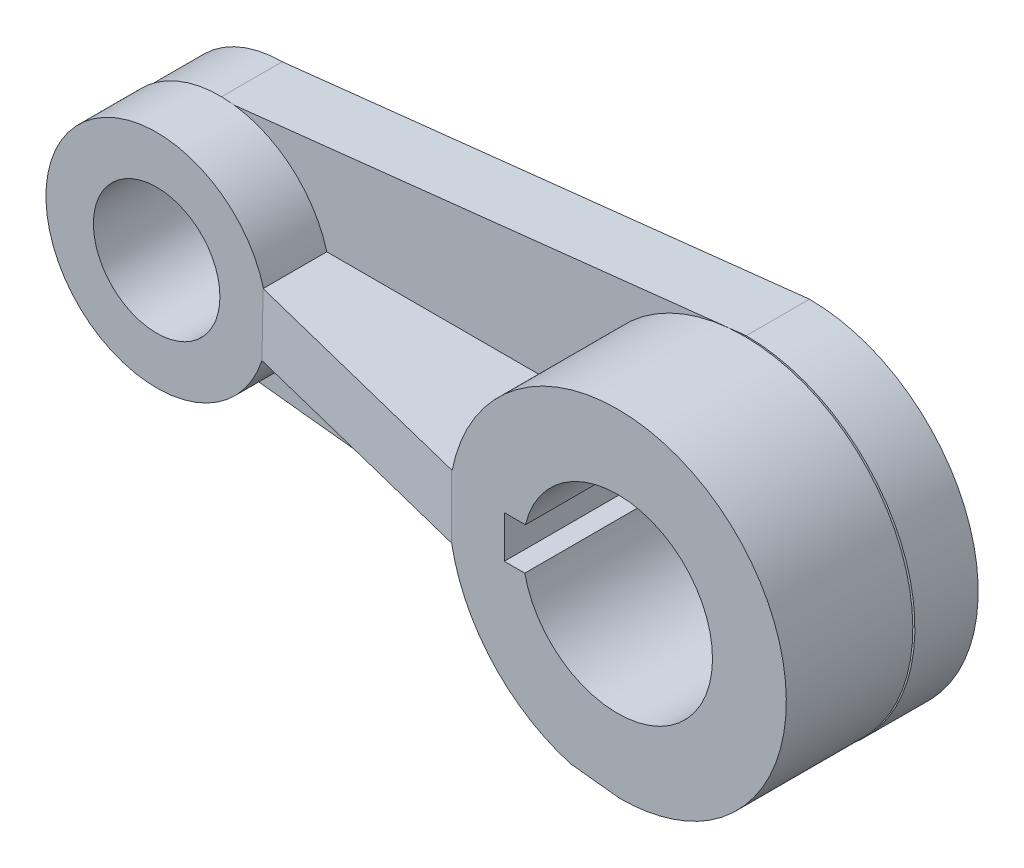
ISO-10303-21;
HEADER;
FILE_DESCRIPTION(('STEP AP214'),'2;1');
FILE_NAME('part.step','',(''),(''),'','','');
FILE_SCHEMA(('AUTOMOTIVE_DESIGN { 1 0 10303 214 1 1 1 1 }'));
ENDSEC;
DATA;
#1=APPLICATION_CONTEXT('core data for automotive mechanical design processes');
#2=APPLICATION_PROTOCOL_DEFINITION('international standard','automotive_design',2000,#1);
#3=PRODUCT_CONTEXT('',#1,'mechanical');
#4=PRODUCT('Part','Part','',(#3));
#5=PRODUCT_RELATED_PRODUCT_CATEGORY('part','',(#4));
#6=PRODUCT_DEFINITION_FORMATION('','',#4);
#7=PRODUCT_DEFINITION_CONTEXT('part definition',#1,'design');
#8=PRODUCT_DEFINITION('design','',#6,#7);
#9=PRODUCT_DEFINITION_SHAPE('','',#8);
#10=(LENGTH_UNIT() NAMED_UNIT(*) SI_UNIT(.MILLI.,.METRE.));
#11=(NAMED_UNIT(*) PLANE_ANGLE_UNIT() SI_UNIT($,.RADIAN.));
#12=(NAMED_UNIT(*) SI_UNIT($,.STERADIAN.) SOLID_ANGLE_UNIT());
#13=UNCERTAINTY_MEASURE_WITH_UNIT(LENGTH_MEASURE(1.E-05),#10,'distance_accuracy_value','');
#14=(GEOMETRIC_REPRESENTATION_CONTEXT(3) GLOBAL_UNCERTAINTY_ASSIGNED_CONTEXT((#13)) GLOBAL_UNIT_ASSIGNED_CONTEXT((#10,
#11,#12)) REPRESENTATION_CONTEXT('',''));
#15=CARTESIAN_POINT('',(0.,0.,0.));
#16=DIRECTION('',(0.,0.,1.));
#17=DIRECTION('',(1.,0.,0.));
#18=AXIS2_PLACEMENT_3D('',#15,#16,#17);
#19=CARTESIAN_POINT('',(0.,0.,0.));
#20=DIRECTION('',(0.,0.,1.));
#21=DIRECTION('',(1.,0.,0.));
#22=AXIS2_PLACEMENT_3D('',#19,#20,#21);
#23=PLANE('',#22);
#24=CARTESIAN_POINT('',(52.5139969891404,-0.249200158089699,0.));
#25=DIRECTION('',(0.,0.,1.));
#26=DIRECTION('',(1.,0.,0.));
#27=AXIS2_PLACEMENT_3D('',#24,#25,#26);
#28=CIRCLE('',#27,32.);
#29=CARTESIAN_POINT('',(21.0349833264114,-6.,0.));
#30=VERTEX_POINT('',#29);
#31=CARTESIAN_POINT('',(43.5657181596066,-30.9726164067577,0.));
#32=VERTEX_POINT('',#31);
#33=EDGE_CURVE('E192',#30,#32,#28,.T.);
#34=ORIENTED_EDGE('',*,*,#33,.F.);
#35=DIRECTION('',(1.,0.,0.));
#36=VECTOR('',#35,1.);
#37=CARTESIAN_POINT('',(-26.9476199003052,-6.,0.));
#38=LINE('',#37,#36);
#39=CARTESIAN_POINT('',(-26.9476199003052,-6.,0.));
#40=VERTEX_POINT('',#39);
#41=EDGE_CURVE('E172',#40,#30,#38,.T.);
#42=ORIENTED_EDGE('',*,*,#41,.F.);
#43=CARTESIAN_POINT('',(-46.916866088649,0.498400316179391,0.));
#44=DIRECTION('',(0.,0.,1.));
#45=DIRECTION('',(1.,0.,0.));
#46=AXIS2_PLACEMENT_3D('',#43,#44,#45);
#47=CIRCLE('',#46,21.);
#48=CARTESIAN_POINT('',(-66.7861244383313,7.2963832989162,0.));
#49=VERTEX_POINT('',#48);
#50=EDGE_CURVE('E204',#49,#40,#47,.T.);
#51=ORIENTED_EDGE('',*,*,#50,.F.);
#52=CARTESIAN_POINT('',(-47.0944309927361,0.,0.));
#53=DIRECTION('',(0.,0.,1.));
#54=DIRECTION('',(1.,0.,0.));
#55=AXIS2_PLACEMENT_3D('',#52,#53,#54);
#56=CIRCLE('',#55,21.);
#57=CARTESIAN_POINT('',(-47.0944309927361,-21.,0.));
#58=VERTEX_POINT('',#57);
#59=EDGE_CURVE('E226',#49,#58,#56,.T.);
#60=ORIENTED_EDGE('',*,*,#59,.T.);
#61=DIRECTION('',(0.994004355935433,-0.109340479152898,0.));
#62=VECTOR('',#61,1.);
#63=CARTESIAN_POINT('',(-2.84541311630482,-25.8673919664074,0.));
#64=LINE('',#63,#62);
#65=EDGE_CURVE('E200',#58,#32,#64,.T.);
#66=ORIENTED_EDGE('',*,*,#65,.T.);
#67=EDGE_LOOP('',(#34,#42,#51,#60,#66));
#68=FACE_BOUND('',#67,.T.);
#69=ADVANCED_FACE('F35',(#68),#23,.T.);
#70=CARTESIAN_POINT('',(-46.916866088649,0.498400316179391,12.));
#71=DIRECTION('',(0.,0.,-1.));
#72=DIRECTION('',(-1.,0.,0.));
#73=AXIS2_PLACEMENT_3D('',#70,#71,#72);
#74=CYLINDRICAL_SURFACE('',#73,21.);
#75=DIRECTION('',(0.,0.,-1.));
#76=VECTOR('',#75,1.);
#77=CARTESIAN_POINT('',(-26.6503320751827,6.,24.));
#78=LINE('',#77,#76);
#79=CARTESIAN_POINT('',(-26.6503320751827,6.,12.));
#80=VERTEX_POINT('',#79);
#81=CARTESIAN_POINT('',(-26.6503320751827,6.,0.));
#82=VERTEX_POINT('',#81);
#83=EDGE_CURVE('E250',#80,#82,#78,.T.);
#84=ORIENTED_EDGE('',*,*,#83,.T.);
#85=CARTESIAN_POINT('',(-44.1853647466023,21.3199972870747,0.));
#86=VERTEX_POINT('',#85);
#87=EDGE_CURVE('E203',#82,#86,#47,.T.);
#88=ORIENTED_EDGE('',*,*,#87,.T.);
#89=EDGE_CURVE('E197',#86,#49,#47,.T.);
#90=ORIENTED_EDGE('',*,*,#89,.T.);
#91=ORIENTED_EDGE('',*,*,#50,.T.);
#92=DIRECTION('',(0.,0.,-1.));
#93=VECTOR('',#92,1.);
#94=CARTESIAN_POINT('',(-26.9476199003052,-6.,24.));
#95=LINE('',#94,#93);
#96=CARTESIAN_POINT('',(-26.9476199003052,-6.,12.));
#97=VERTEX_POINT('',#96);
#98=EDGE_CURVE('E175',#97,#40,#95,.T.);
#99=ORIENTED_EDGE('',*,*,#98,.F.);
#100=CARTESIAN_POINT('',(-46.916866088649,0.498400316179391,12.));
#101=DIRECTION('',(0.,0.,1.));
#102=DIRECTION('',(1.,0.,0.));
#103=AXIS2_PLACEMENT_3D('',#100,#101,#102);
#104=CIRCLE('',#103,21.);
#105=EDGE_CURVE('E198',#80,#97,#104,.T.);
#106=ORIENTED_EDGE('',*,*,#105,.F.);
#107=EDGE_LOOP('',(#84,#88,#90,#91,#99,#106));
#108=FACE_BOUND('',#107,.T.);
#109=ADVANCED_FACE('F248',(#108),#74,.T.);
#110=CARTESIAN_POINT('',(-46.916866088649,0.498400316179391,12.));
#111=DIRECTION('',(0.,0.,1.));
#112=DIRECTION('',(1.,0.,0.));
#113=AXIS2_PLACEMENT_3D('',#110,#111,#112);
#114=PLANE('',#113);
#115=ORIENTED_EDGE('',*,*,#105,.T.);
#116=DIRECTION('',(0.0247663864034664,0.999693266009387,0.));
#117=VECTOR('',#116,1.);
#118=CARTESIAN_POINT('',(-26.798975987744,0.,12.));
#119=LINE('',#118,#117);
#120=EDGE_CURVE('E43',#97,#80,#119,.T.);
#121=ORIENTED_EDGE('',*,*,#120,.T.);
#122=EDGE_LOOP('',(#115,#121));
#123=FACE_BOUND('',#122,.T.);
#124=CARTESIAN_POINT('',(-46.916866088649,0.498400316179391,12.));
#125=DIRECTION('',(0.,0.,1.));
#126=DIRECTION('',(1.,0.,0.));
#127=AXIS2_PLACEMENT_3D('',#124,#125,#126);
#128=CIRCLE('',#127,12.);
#129=CARTESIAN_POINT('',(-34.916866088649,0.498400316179391,12.));
#130=VERTEX_POINT('',#129);
#131=EDGE_CURVE('E284',#130,#130,#128,.T.);
#132=ORIENTED_EDGE('',*,*,#131,.F.);
#133=EDGE_LOOP('',(#132));
#134=FACE_BOUND('',#133,.T.);
#135=ADVANCED_FACE('F242',(#123,#134),#114,.T.);
#136=CARTESIAN_POINT('',(52.5139969891404,-0.249200158089699,24.));
#137=DIRECTION('',(0.,0.,-1.));
#138=DIRECTION('',(-1.,0.,0.));
#139=AXIS2_PLACEMENT_3D('',#136,#137,#138);
#140=CYLINDRICAL_SURFACE('',#139,32.);
#141=CARTESIAN_POINT('',(52.5139969891404,-0.249200158089699,24.));
#142=DIRECTION('',(0.,0.,1.));
#143=DIRECTION('',(1.,0.,0.));
#144=AXIS2_PLACEMENT_3D('',#141,#142,#143);
#145=CIRCLE('',#144,32.);
#146=CARTESIAN_POINT('',(21.0349833264113,-6.,24.));
#147=VERTEX_POINT('',#146);
#148=CARTESIAN_POINT('',(43.5657181596066,-30.9726164067577,24.));
#149=VERTEX_POINT('',#148);
#150=EDGE_CURVE('E163',#147,#149,#145,.T.);
#151=ORIENTED_EDGE('',*,*,#150,.F.);
#152=DIRECTION('',(0.,0.,-1.));
#153=VECTOR('',#152,1.);
#154=CARTESIAN_POINT('',(21.0349833264114,-6.,24.));
#155=LINE('',#154,#153);
#156=EDGE_CURVE('E169',#147,#30,#155,.T.);
#157=ORIENTED_EDGE('',*,*,#156,.T.);
#158=ORIENTED_EDGE('',*,*,#33,.T.);
#159=DIRECTION('',(0.,0.,-1.));
#160=VECTOR('',#159,1.);
#161=CARTESIAN_POINT('',(43.5657181596066,-30.9726164067577,24.));
#162=LINE('',#161,#160);
#163=EDGE_CURVE('E180',#149,#32,#162,.T.);
#164=ORIENTED_EDGE('',*,*,#163,.F.);
#165=EDGE_LOOP('',(#151,#157,#158,#164));
#166=FACE_BOUND('',#165,.T.);
#167=ADVANCED_FACE('F178',(#166),#140,.T.);
#168=DIRECTION('',(1.,0.,0.));
#169=VECTOR('',#168,1.);
#170=CARTESIAN_POINT('',(-26.6503320751827,6.,0.));
#171=LINE('',#170,#169);
#172=CARTESIAN_POINT('',(21.1301237835571,6.,0.));
#173=VERTEX_POINT('',#172);
#174=EDGE_CURVE('E326',#82,#173,#171,.T.);
#175=ORIENTED_EDGE('',*,*,#174,.T.);
#176=CARTESIAN_POINT('',(69.8902284842106,-27.1204967220766,0.));
#177=VERTEX_POINT('',#176);
#178=EDGE_CURVE('E58',#177,#173,#28,.T.);
#179=ORIENTED_EDGE('',*,*,#178,.F.);
#180=CARTESIAN_POINT('',(52.9055690072639,0.,0.));
#181=DIRECTION('',(0.,0.,1.));
#182=DIRECTION('',(1.,0.,0.));
#183=AXIS2_PLACEMENT_3D('',#180,#181,#182);
#184=CIRCLE('',#183,32.);
#185=CARTESIAN_POINT('',(52.9055690072639,32.,0.));
#186=VERTEX_POINT('',#185);
#187=EDGE_CURVE('E220',#177,#186,#184,.T.);
#188=ORIENTED_EDGE('',*,*,#187,.T.);
#189=DIRECTION('',(0.994004355935433,0.109340479152898,0.));
#190=VECTOR('',#189,1.);
#191=CARTESIAN_POINT('',(-2.84541311630482,25.8673919664074,0.));
#192=LINE('',#191,#190);
#193=EDGE_CURVE('E222',#86,#186,#192,.T.);
#194=ORIENTED_EDGE('',*,*,#193,.F.);
#195=ORIENTED_EDGE('',*,*,#87,.F.);
#196=EDGE_LOOP('',(#175,#179,#188,#194,#195));
#197=FACE_BOUND('',#196,.T.);
#198=ADVANCED_FACE('F308',(#197),#23,.T.);
#199=CARTESIAN_POINT('',(-2.84541311630482,-25.8673919664074,-12.));
#200=DIRECTION('',(-0.109340479152898,-0.994004355935433,0.));
#201=DIRECTION('',(0.994004355935433,-0.109340479152898,0.));
#202=AXIS2_PLACEMENT_3D('',#199,#200,#201);
#203=PLANE('',#202);
#204=ORIENTED_EDGE('',*,*,#65,.F.);
#205=DIRECTION('',(0.,0.,1.));
#206=VECTOR('',#205,1.);
#207=CARTESIAN_POINT('',(-47.0944309927361,-21.,-12.));
#208=LINE('',#207,#206);
#209=CARTESIAN_POINT('',(-47.0944309927361,-21.,-12.));
#210=VERTEX_POINT('',#209);
#211=EDGE_CURVE('E229',#210,#58,#208,.T.);
#212=ORIENTED_EDGE('',*,*,#211,.F.);
#213=DIRECTION('',(0.994004355935433,-0.109340479152898,0.));
#214=VECTOR('',#213,1.);
#215=CARTESIAN_POINT('',(-2.84541311630482,-25.8673919664074,-12.));
#216=LINE('',#215,#214);
#217=CARTESIAN_POINT('',(52.9055690072639,-32.,-12.));
#218=VERTEX_POINT('',#217);
#219=EDGE_CURVE('E205',#210,#218,#216,.T.);
#220=ORIENTED_EDGE('',*,*,#219,.T.);
#221=DIRECTION('',(0.,0.,1.));
#222=VECTOR('',#221,1.);
#223=CARTESIAN_POINT('',(52.9055690072639,-32.,-12.));
#224=LINE('',#223,#222);
#225=CARTESIAN_POINT('',(52.9055690072639,-32.,24.));
#226=VERTEX_POINT('',#225);
#227=EDGE_CURVE('E217',#218,#226,#224,.T.);
#228=ORIENTED_EDGE('',*,*,#227,.T.);
#229=DIRECTION('',(0.994004355935433,-0.109340479152898,0.));
#230=VECTOR('',#229,1.);
#231=CARTESIAN_POINT('',(-2.84541311630482,-25.8673919664074,24.));
#232=LINE('',#231,#230);
#233=EDGE_CURVE('E185',#149,#226,#232,.T.);
#234=ORIENTED_EDGE('',*,*,#233,.F.);
#235=ORIENTED_EDGE('',*,*,#163,.T.);
#236=EDGE_LOOP('',(#204,#212,#220,#228,#234,#235));
#237=FACE_BOUND('',#236,.T.);
#238=ADVANCED_FACE('F37',(#237),#203,.T.);
#239=CARTESIAN_POINT('',(-47.0944309927361,0.,-12.));
#240=DIRECTION('',(0.,0.,1.));
#241=DIRECTION('',(1.,0.,0.));
#242=AXIS2_PLACEMENT_3D('',#239,#240,#241);
#243=CYLINDRICAL_SURFACE('',#242,21.);
#244=CARTESIAN_POINT('',(-47.0944309927361,21.,0.));
#245=VERTEX_POINT('',#244);
#246=EDGE_CURVE('E209',#245,#49,#56,.T.);
#247=ORIENTED_EDGE('',*,*,#246,.F.);
#248=DIRECTION('',(0.,0.,1.));
#249=VECTOR('',#248,1.);
#250=CARTESIAN_POINT('',(-47.0944309927361,21.,-12.));
#251=LINE('',#250,#249);
#252=CARTESIAN_POINT('',(-47.0944309927361,21.,-12.));
#253=VERTEX_POINT('',#252);
#254=EDGE_CURVE('E232',#253,#245,#251,.T.);
#255=ORIENTED_EDGE('',*,*,#254,.F.);
#256=CARTESIAN_POINT('',(-47.0944309927361,0.,-12.));
#257=DIRECTION('',(0.,0.,1.));
#258=DIRECTION('',(1.,0.,0.));
#259=AXIS2_PLACEMENT_3D('',#256,#257,#258);
#260=CIRCLE('',#259,21.);
#261=EDGE_CURVE('E214',#253,#210,#260,.T.);
#262=ORIENTED_EDGE('',*,*,#261,.T.);
#263=ORIENTED_EDGE('',*,*,#211,.T.);
#264=ORIENTED_EDGE('',*,*,#59,.F.);
#265=EDGE_LOOP('',(#247,#255,#262,#263,#264));
#266=FACE_BOUND('',#265,.T.);
#267=ADVANCED_FACE('F324',(#266),#243,.T.);
#268=CARTESIAN_POINT('',(-2.84541311630482,25.8673919664074,-12.));
#269=DIRECTION('',(0.109340479152898,-0.994004355935433,0.));
#270=DIRECTION('',(0.994004355935433,0.109340479152898,0.));
#271=AXIS2_PLACEMENT_3D('',#268,#269,#270);
#272=PLANE('',#271);
#273=EDGE_CURVE('E223',#245,#86,#192,.T.);
#274=ORIENTED_EDGE('',*,*,#273,.T.);
#275=ORIENTED_EDGE('',*,*,#193,.T.);
#276=DIRECTION('',(0.,0.,1.));
#277=VECTOR('',#276,1.);
#278=CARTESIAN_POINT('',(52.9055690072639,32.,-12.));
#279=LINE('',#278,#277);
#280=CARTESIAN_POINT('',(52.9055690072639,32.,-12.));
#281=VERTEX_POINT('',#280);
#282=EDGE_CURVE('E234',#281,#186,#279,.T.);
#283=ORIENTED_EDGE('',*,*,#282,.F.);
#284=DIRECTION('',(0.994004355935433,0.109340479152898,0.));
#285=VECTOR('',#284,1.);
#286=CARTESIAN_POINT('',(-2.84541311630482,25.8673919664074,-12.));
#287=LINE('',#286,#285);
#288=EDGE_CURVE('E212',#253,#281,#287,.T.);
#289=ORIENTED_EDGE('',*,*,#288,.F.);
#290=ORIENTED_EDGE('',*,*,#254,.T.);
#291=EDGE_LOOP('',(#274,#275,#283,#289,#290));
#292=FACE_BOUND('',#291,.T.);
#293=ADVANCED_FACE('F341',(#292),#272,.F.);
#294=CARTESIAN_POINT('',(52.9055690072639,0.,-12.));
#295=DIRECTION('',(0.,0.,1.));
#296=DIRECTION('',(1.,0.,0.));
#297=AXIS2_PLACEMENT_3D('',#294,#295,#296);
#298=CYLINDRICAL_SURFACE('',#297,32.);
#299=ORIENTED_EDGE('',*,*,#187,.F.);
#300=DIRECTION('',(0.,0.,-1.));
#301=VECTOR('',#300,1.);
#302=CARTESIAN_POINT('',(69.8902284842106,-27.1204967220766,24.));
#303=LINE('',#302,#301);
#304=CARTESIAN_POINT('',(69.8902284842106,-27.1204967220766,24.));
#305=VERTEX_POINT('',#304);
#306=EDGE_CURVE('E194',#305,#177,#303,.T.);
#307=ORIENTED_EDGE('',*,*,#306,.F.);
#308=CARTESIAN_POINT('',(52.9055690072639,0.,24.));
#309=DIRECTION('',(0.,0.,1.));
#310=DIRECTION('',(1.,0.,0.));
#311=AXIS2_PLACEMENT_3D('',#308,#309,#310);
#312=CIRCLE('',#311,32.);
#313=EDGE_CURVE('E183',#226,#305,#312,.T.);
#314=ORIENTED_EDGE('',*,*,#313,.F.);
#315=ORIENTED_EDGE('',*,*,#227,.F.);
#316=CARTESIAN_POINT('',(52.9055690072639,0.,-12.));
#317=DIRECTION('',(0.,0.,1.));
#318=DIRECTION('',(1.,0.,0.));
#319=AXIS2_PLACEMENT_3D('',#316,#317,#318);
#320=CIRCLE('',#319,32.);
#321=EDGE_CURVE('E208',#218,#281,#320,.T.);
#322=ORIENTED_EDGE('',*,*,#321,.T.);
#323=ORIENTED_EDGE('',*,*,#282,.T.);
#324=EDGE_LOOP('',(#299,#307,#314,#315,#322,#323));
#325=FACE_BOUND('',#324,.T.);
#326=ADVANCED_FACE('F336',(#325),#298,.T.);
#327=CARTESIAN_POINT('',(0.,0.,-12.));
#328=DIRECTION('',(0.,0.,1.));
#329=DIRECTION('',(1.,0.,0.));
#330=AXIS2_PLACEMENT_3D('',#327,#328,#329);
#331=PLANE('',#330);
#332=DIRECTION('',(0.,-1.,0.));
#333=VECTOR('',#332,1.);
#334=CARTESIAN_POINT('',(31.0227335122932,4.,-12.));
#335=LINE('',#334,#333);
#336=CARTESIAN_POINT('',(31.0227335122932,4.,-12.));
#337=VERTEX_POINT('',#336);
#338=CARTESIAN_POINT('',(31.0227335122932,-4.,-12.));
#339=VERTEX_POINT('',#338);
#340=EDGE_CURVE('E260',#337,#339,#335,.T.);
#341=ORIENTED_EDGE('',*,*,#340,.T.);
#342=DIRECTION('',(1.,0.,0.));
#343=VECTOR('',#342,1.);
#344=CARTESIAN_POINT('',(31.0227335122932,-4.,-12.));
#345=LINE('',#344,#343);
#346=CARTESIAN_POINT('',(34.9091254887311,-4.,-12.));
#347=VERTEX_POINT('',#346);
#348=EDGE_CURVE('E263',#339,#347,#345,.T.);
#349=ORIENTED_EDGE('',*,*,#348,.T.);
#350=CARTESIAN_POINT('',(52.5139969891404,-0.249200158089699,-12.));
#351=DIRECTION('',(0.,0.,1.));
#352=DIRECTION('',(1.,0.,0.));
#353=AXIS2_PLACEMENT_3D('',#350,#351,#352);
#354=CIRCLE('',#353,18.);
#355=CARTESIAN_POINT('',(35.0227335122932,4.,-12.));
#356=VERTEX_POINT('',#355);
#357=EDGE_CURVE('E288',#347,#356,#354,.T.);
#358=ORIENTED_EDGE('',*,*,#357,.T.);
#359=DIRECTION('',(-1.,0.,0.));
#360=VECTOR('',#359,1.);
#361=CARTESIAN_POINT('',(35.0227335122932,4.,-12.));
#362=LINE('',#361,#360);
#363=EDGE_CURVE('E50',#356,#337,#362,.T.);
#364=ORIENTED_EDGE('',*,*,#363,.T.);
#365=EDGE_LOOP('',(#341,#349,#358,#364));
#366=FACE_BOUND('',#365,.T.);
#367=CARTESIAN_POINT('',(-46.916866088649,0.498400316179391,-12.));
#368=DIRECTION('',(0.,0.,1.));
#369=DIRECTION('',(1.,0.,0.));
#370=AXIS2_PLACEMENT_3D('',#367,#368,#369);
#371=CIRCLE('',#370,12.);
#372=CARTESIAN_POINT('',(-34.916866088649,0.498400316179391,-12.));
#373=VERTEX_POINT('',#372);
#374=EDGE_CURVE('E287',#373,#373,#371,.T.);
#375=ORIENTED_EDGE('',*,*,#374,.T.);
#376=EDGE_LOOP('',(#375));
#377=FACE_BOUND('',#376,.T.);
#378=ORIENTED_EDGE('',*,*,#219,.F.);
#379=ORIENTED_EDGE('',*,*,#261,.F.);
#380=ORIENTED_EDGE('',*,*,#288,.T.);
#381=ORIENTED_EDGE('',*,*,#321,.F.);
#382=EDGE_LOOP('',(#378,#379,#380,#381));
#383=FACE_BOUND('',#382,.T.);
#384=ADVANCED_FACE('F293',(#366,#377,#383),#331,.F.);
#385=CARTESIAN_POINT('',(-46.916866088649,0.498400316179391,0.));
#386=DIRECTION('',(0.,0.,1.));
#387=DIRECTION('',(1.,0.,0.));
#388=AXIS2_PLACEMENT_3D('',#385,#386,#387);
#389=PLANE('',#388);
#390=ORIENTED_EDGE('',*,*,#273,.F.);
#391=ORIENTED_EDGE('',*,*,#246,.T.);
#392=ORIENTED_EDGE('',*,*,#89,.F.);
#393=EDGE_LOOP('',(#390,#391,#392));
#394=FACE_BOUND('',#393,.T.);
#395=ADVANCED_FACE('F346',(#394),#389,.F.);
#396=ORIENTED_EDGE('',*,*,#178,.T.);
#397=DIRECTION('',(0.,0.,-1.));
#398=VECTOR('',#397,1.);
#399=CARTESIAN_POINT('',(21.1301237835571,6.,24.));
#400=LINE('',#399,#398);
#401=CARTESIAN_POINT('',(21.1301237835571,6.,24.));
#402=VERTEX_POINT('',#401);
#403=EDGE_CURVE('E176',#402,#173,#400,.T.);
#404=ORIENTED_EDGE('',*,*,#403,.F.);
#405=EDGE_CURVE('E182',#305,#402,#145,.T.);
#406=ORIENTED_EDGE('',*,*,#405,.F.);
#407=ORIENTED_EDGE('',*,*,#306,.T.);
#408=EDGE_LOOP('',(#396,#404,#406,#407));
#409=FACE_BOUND('',#408,.T.);
#410=ADVANCED_FACE('F310',(#409),#140,.T.);
#411=CARTESIAN_POINT('',(0.,0.,24.));
#412=DIRECTION('',(0.,0.,1.));
#413=DIRECTION('',(1.,0.,0.));
#414=AXIS2_PLACEMENT_3D('',#411,#412,#413);
#415=PLANE('',#414);
#416=DIRECTION('',(0.,1.,0.));
#417=VECTOR('',#416,1.);
#418=CARTESIAN_POINT('',(21.0349833264113,-32.,24.));
#419=LINE('',#418,#417);
#420=CARTESIAN_POINT('',(21.0349833264113,6.,24.));
#421=VERTEX_POINT('',#420);
#422=EDGE_CURVE('E150',#147,#421,#419,.T.);
#423=ORIENTED_EDGE('',*,*,#422,.F.);
#424=ORIENTED_EDGE('',*,*,#150,.T.);
#425=ORIENTED_EDGE('',*,*,#233,.T.);
#426=ORIENTED_EDGE('',*,*,#313,.T.);
#427=ORIENTED_EDGE('',*,*,#405,.T.);
#428=DIRECTION('',(1.,0.,0.));
#429=VECTOR('',#428,1.);
#430=CARTESIAN_POINT('',(-26.6503320751827,6.,24.));
#431=LINE('',#430,#429);
#432=EDGE_CURVE('E166',#421,#402,#431,.T.);
#433=ORIENTED_EDGE('',*,*,#432,.F.);
#434=EDGE_LOOP('',(#423,#424,#425,#426,#427,#433));
#435=FACE_BOUND('',#434,.T.);
#436=DIRECTION('',(1.,0.,0.));
#437=VECTOR('',#436,1.);
#438=CARTESIAN_POINT('',(0.,-4.00000000000001,24.));
#439=LINE('',#438,#437);
#440=CARTESIAN_POINT('',(31.0227335122932,-4.,24.));
#441=VERTEX_POINT('',#440);
#442=CARTESIAN_POINT('',(34.9091254887311,-4.,24.));
#443=VERTEX_POINT('',#442);
#444=EDGE_CURVE('E279',#441,#443,#439,.T.);
#445=ORIENTED_EDGE('',*,*,#444,.F.);
#446=DIRECTION('',(0.,-1.,0.));
#447=VECTOR('',#446,1.);
#448=CARTESIAN_POINT('',(31.0227335122932,0.,24.));
#449=LINE('',#448,#447);
#450=CARTESIAN_POINT('',(31.0227335122932,4.,24.));
#451=VERTEX_POINT('',#450);
#452=EDGE_CURVE('E238',#451,#441,#449,.T.);
#453=ORIENTED_EDGE('',*,*,#452,.F.);
#454=DIRECTION('',(-1.,0.,0.));
#455=VECTOR('',#454,1.);
#456=CARTESIAN_POINT('',(0.,4.,24.));
#457=LINE('',#456,#455);
#458=CARTESIAN_POINT('',(35.0227335122932,4.,24.));
#459=VERTEX_POINT('',#458);
#460=EDGE_CURVE('E270',#459,#451,#457,.T.);
#461=ORIENTED_EDGE('',*,*,#460,.F.);
#462=CARTESIAN_POINT('',(52.5139969891404,-0.249200158089699,24.));
#463=DIRECTION('',(0.,0.,1.));
#464=DIRECTION('',(1.,0.,0.));
#465=AXIS2_PLACEMENT_3D('',#462,#463,#464);
#466=CIRCLE('',#465,18.);
#467=EDGE_CURVE('E281',#443,#459,#466,.T.);
#468=ORIENTED_EDGE('',*,*,#467,.F.);
#469=EDGE_LOOP('',(#445,#453,#461,#468));
#470=FACE_BOUND('',#469,.T.);
#471=ADVANCED_FACE('F159',(#435,#470),#415,.T.);
#472=CARTESIAN_POINT('',(-46.916866088649,0.498400316179391,-12.));
#473=DIRECTION('',(0.,0.,1.));
#474=DIRECTION('',(1.,0.,0.));
#475=AXIS2_PLACEMENT_3D('',#472,#473,#474);
#476=CYLINDRICAL_SURFACE('',#475,12.);
#477=ORIENTED_EDGE('',*,*,#374,.F.);
#478=EDGE_LOOP('',(#477));
#479=FACE_BOUND('',#478,.T.);
#480=ORIENTED_EDGE('',*,*,#131,.T.);
#481=EDGE_LOOP('',(#480));
#482=FACE_BOUND('',#481,.T.);
#483=ADVANCED_FACE('F296',(#479,#482),#476,.F.);
#484=CARTESIAN_POINT('',(52.5139969891404,-0.249200158089699,-12.));
#485=DIRECTION('',(0.,0.,1.));
#486=DIRECTION('',(1.,0.,0.));
#487=AXIS2_PLACEMENT_3D('',#484,#485,#486);
#488=CYLINDRICAL_SURFACE('',#487,18.);
#489=ORIENTED_EDGE('',*,*,#357,.F.);
#490=DIRECTION('',(0.,0.,1.));
#491=VECTOR('',#490,1.);
#492=CARTESIAN_POINT('',(34.9091254887311,-4.,-12.));
#493=LINE('',#492,#491);
#494=EDGE_CURVE('E267',#347,#443,#493,.T.);
#495=ORIENTED_EDGE('',*,*,#494,.T.);
#496=ORIENTED_EDGE('',*,*,#467,.T.);
#497=DIRECTION('',(0.,0.,1.));
#498=VECTOR('',#497,1.);
#499=CARTESIAN_POINT('',(35.0227335122932,4.,-12.));
#500=LINE('',#499,#498);
#501=EDGE_CURVE('E266',#356,#459,#500,.T.);
#502=ORIENTED_EDGE('',*,*,#501,.F.);
#503=EDGE_LOOP('',(#489,#495,#496,#502));
#504=FACE_BOUND('',#503,.T.);
#505=ADVANCED_FACE('F299',(#504),#488,.F.);
#506=CARTESIAN_POINT('',(31.0227335122932,-4.,-12.));
#507=DIRECTION('',(0.,-1.,0.));
#508=DIRECTION('',(1.,0.,0.));
#509=AXIS2_PLACEMENT_3D('',#506,#507,#508);
#510=PLANE('',#509);
#511=ORIENTED_EDGE('',*,*,#444,.T.);
#512=ORIENTED_EDGE('',*,*,#494,.F.);
#513=ORIENTED_EDGE('',*,*,#348,.F.);
#514=DIRECTION('',(0.,0.,1.));
#515=VECTOR('',#514,1.);
#516=CARTESIAN_POINT('',(31.0227335122932,-4.,-12.));
#517=LINE('',#516,#515);
#518=EDGE_CURVE('E271',#339,#441,#517,.T.);
#519=ORIENTED_EDGE('',*,*,#518,.T.);
#520=EDGE_LOOP('',(#511,#512,#513,#519));
#521=FACE_BOUND('',#520,.T.);
#522=ADVANCED_FACE('F368',(#521),#510,.F.);
#523=CARTESIAN_POINT('',(31.0227335122932,4.,-12.));
#524=DIRECTION('',(-1.,0.,0.));
#525=DIRECTION('',(0.,0.,1.));
#526=AXIS2_PLACEMENT_3D('',#523,#524,#525);
#527=PLANE('',#526);
#528=ORIENTED_EDGE('',*,*,#452,.T.);
#529=ORIENTED_EDGE('',*,*,#518,.F.);
#530=ORIENTED_EDGE('',*,*,#340,.F.);
#531=DIRECTION('',(0.,0.,1.));
#532=VECTOR('',#531,1.);
#533=CARTESIAN_POINT('',(31.0227335122932,4.,-12.));
#534=LINE('',#533,#532);
#535=EDGE_CURVE('E274',#337,#451,#534,.T.);
#536=ORIENTED_EDGE('',*,*,#535,.T.);
#537=EDGE_LOOP('',(#528,#529,#530,#536));
#538=FACE_BOUND('',#537,.T.);
#539=ADVANCED_FACE('F364',(#538),#527,.F.);
#540=CARTESIAN_POINT('',(35.0227335122932,4.,-12.));
#541=DIRECTION('',(0.,1.,0.));
#542=DIRECTION('',(0.,0.,1.));
#543=AXIS2_PLACEMENT_3D('',#540,#541,#542);
#544=PLANE('',#543);
#545=ORIENTED_EDGE('',*,*,#460,.T.);
#546=ORIENTED_EDGE('',*,*,#535,.F.);
#547=ORIENTED_EDGE('',*,*,#363,.F.);
#548=ORIENTED_EDGE('',*,*,#501,.T.);
#549=EDGE_LOOP('',(#545,#546,#547,#548));
#550=FACE_BOUND('',#549,.T.);
#551=ADVANCED_FACE('F357',(#550),#544,.F.);
#552=CARTESIAN_POINT('',(-26.6503320751827,6.,24.));
#553=DIRECTION('',(0.,1.,0.));
#554=DIRECTION('',(0.,0.,1.));
#555=AXIS2_PLACEMENT_3D('',#552,#553,#554);
#556=PLANE('',#555);
#557=DIRECTION('',(-0.970121806531821,0.,-0.242618384487733));
#558=VECTOR('',#557,1.);
#559=CARTESIAN_POINT('',(-23.8433989052498,6.,12.7763366186002));
#560=LINE('',#559,#558);
#561=CARTESIAN_POINT('',(-26.6503320751827,6.,12.0743489027599));
#562=VERTEX_POINT('',#561);
#563=EDGE_CURVE('E329',#421,#562,#560,.T.);
#564=ORIENTED_EDGE('',*,*,#563,.F.);
#565=ORIENTED_EDGE('',*,*,#432,.T.);
#566=ORIENTED_EDGE('',*,*,#403,.T.);
#567=ORIENTED_EDGE('',*,*,#174,.F.);
#568=ORIENTED_EDGE('',*,*,#83,.F.);
#569=EDGE_CURVE('E254',#562,#80,#78,.T.);
#570=ORIENTED_EDGE('',*,*,#569,.F.);
#571=EDGE_LOOP('',(#564,#565,#566,#567,#568,#570));
#572=FACE_BOUND('',#571,.T.);
#573=ADVANCED_FACE('F355',(#572),#556,.T.);
#574=CARTESIAN_POINT('',(-26.6503320751827,6.,24.));
#575=DIRECTION('',(0.999693266009386,-0.0247663864034664,0.));
#576=DIRECTION('',(0.0247663864034664,0.999693266009387,0.));
#577=AXIS2_PLACEMENT_3D('',#574,#575,#576);
#578=PLANE('',#577);
#579=ORIENTED_EDGE('',*,*,#120,.F.);
#580=DIRECTION('',(0.0247659113523734,0.999674090608869,0.00619372264619036));
#581=VECTOR('',#580,1.);
#582=CARTESIAN_POINT('',(-26.6485027615658,6.07384010224315,12.074806396975));
#583=LINE('',#582,#581);
#584=EDGE_CURVE('E153',#97,#562,#583,.T.);
#585=ORIENTED_EDGE('',*,*,#584,.T.);
#586=ORIENTED_EDGE('',*,*,#569,.T.);
#587=EDGE_LOOP('',(#579,#585,#586));
#588=FACE_BOUND('',#587,.T.);
#589=ADVANCED_FACE('F354',(#588),#578,.F.);
#590=CARTESIAN_POINT('',(-26.9476199003052,-6.,24.));
#591=DIRECTION('',(0.,1.,0.));
#592=DIRECTION('',(0.,0.,1.));
#593=AXIS2_PLACEMENT_3D('',#590,#591,#592);
#594=PLANE('',#593);
#595=ORIENTED_EDGE('',*,*,#156,.F.);
#596=DIRECTION('',(-0.970121806531821,0.,-0.242618384487733));
#597=VECTOR('',#596,1.);
#598=CARTESIAN_POINT('',(-24.1231872748204,-6.,12.7063641658972));
#599=LINE('',#598,#597);
#600=EDGE_CURVE('E11',#147,#97,#599,.T.);
#601=ORIENTED_EDGE('',*,*,#600,.T.);
#602=ORIENTED_EDGE('',*,*,#98,.T.);
#603=ORIENTED_EDGE('',*,*,#41,.T.);
#604=EDGE_LOOP('',(#595,#601,#602,#603));
#605=FACE_BOUND('',#604,.T.);
#606=ADVANCED_FACE('F170',(#605),#594,.F.);
#607=CARTESIAN_POINT('',(-4.41066871330112,-32.,17.6362805695683));
#608=DIRECTION('',(0.242618384487733,0.,-0.97012180653182));
#609=DIRECTION('',(-0.970121806531821,0.,-0.242618384487733));
#610=AXIS2_PLACEMENT_3D('',#607,#608,#609);
#611=PLANE('',#610);
#612=ORIENTED_EDGE('',*,*,#563,.T.);
#613=ORIENTED_EDGE('',*,*,#584,.F.);
#614=ORIENTED_EDGE('',*,*,#600,.F.);
#615=ORIENTED_EDGE('',*,*,#422,.T.);
#616=EDGE_LOOP('',(#612,#613,#614,#615));
#617=FACE_BOUND('',#616,.T.);
#618=ADVANCED_FACE('F149',(#617),#611,.F.);
#619=CLOSED_SHELL('',(#69,#109,#135,#167,#198,#238,#267,#293,#326,#384,#395,#410,#471,#483,#505,
#522,#539,#551,#573,#589,#606,#618));
#620=MANIFOLD_SOLID_BREP('B2',#619);
#621=ADVANCED_BREP_SHAPE_REPRESENTATION('',(#18,#620),#14);
#622=SHAPE_DEFINITION_REPRESENTATION(#9,#621);
ENDSEC;
END-ISO-10303-21;
